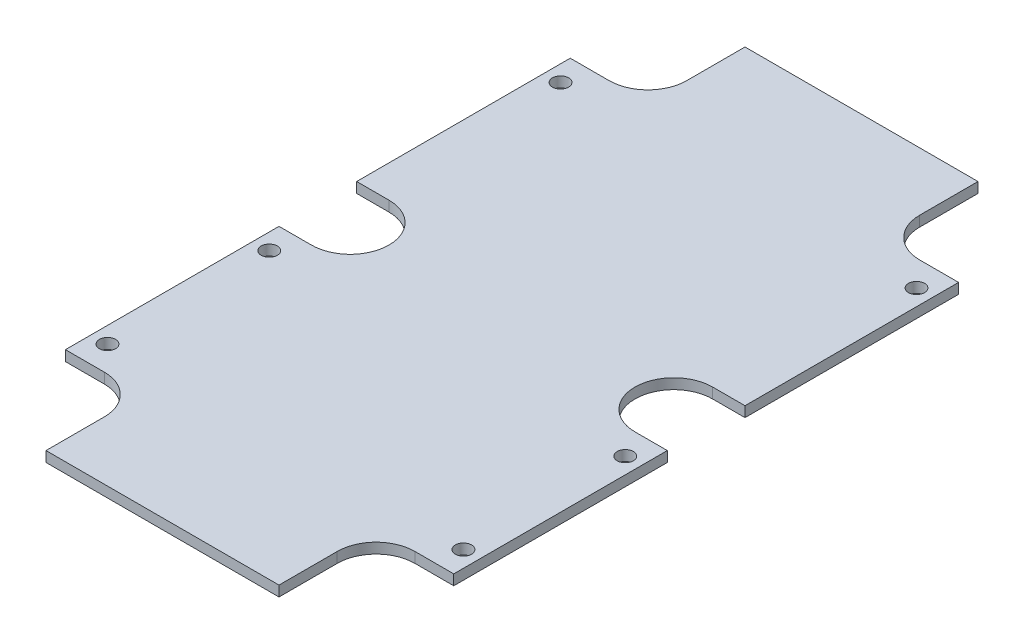
ISO-10303-21;
HEADER;
FILE_DESCRIPTION(('STEP AP214'),'2;1');
FILE_NAME('part.step','',(''),(''),'','','');
FILE_SCHEMA(('AUTOMOTIVE_DESIGN { 1 0 10303 214 1 1 1 1 }'));
ENDSEC;
DATA;
#1=APPLICATION_CONTEXT('core data for automotive mechanical design processes');
#2=APPLICATION_PROTOCOL_DEFINITION('international standard','automotive_design',2000,#1);
#3=PRODUCT_CONTEXT('',#1,'mechanical');
#4=PRODUCT('Part','Part','',(#3));
#5=PRODUCT_RELATED_PRODUCT_CATEGORY('part','',(#4));
#6=PRODUCT_DEFINITION_FORMATION('','',#4);
#7=PRODUCT_DEFINITION_CONTEXT('part definition',#1,'design');
#8=PRODUCT_DEFINITION('design','',#6,#7);
#9=PRODUCT_DEFINITION_SHAPE('','',#8);
#10=(LENGTH_UNIT() NAMED_UNIT(*) SI_UNIT(.MILLI.,.METRE.));
#11=(NAMED_UNIT(*) PLANE_ANGLE_UNIT() SI_UNIT($,.RADIAN.));
#12=(NAMED_UNIT(*) SI_UNIT($,.STERADIAN.) SOLID_ANGLE_UNIT());
#13=UNCERTAINTY_MEASURE_WITH_UNIT(LENGTH_MEASURE(1.E-05),#10,'distance_accuracy_value','');
#14=(GEOMETRIC_REPRESENTATION_CONTEXT(3) GLOBAL_UNCERTAINTY_ASSIGNED_CONTEXT((#13)) GLOBAL_UNIT_ASSIGNED_CONTEXT((#10,
#11,#12)) REPRESENTATION_CONTEXT('',''));
#15=CARTESIAN_POINT('',(0.,0.,0.));
#16=DIRECTION('',(0.,0.,1.));
#17=DIRECTION('',(1.,0.,0.));
#18=AXIS2_PLACEMENT_3D('',#15,#16,#17);
#19=CARTESIAN_POINT('',(24.,1.6,45.));
#20=DIRECTION('',(0.,-1.,0.));
#21=DIRECTION('',(0.,0.,-1.));
#22=AXIS2_PLACEMENT_3D('',#19,#20,#21);
#23=CYLINDRICAL_SURFACE('',#22,6.);
#24=CARTESIAN_POINT('',(24.,0.,45.));
#25=DIRECTION('',(0.,1.,0.));
#26=DIRECTION('',(0.,0.,1.));
#27=AXIS2_PLACEMENT_3D('',#24,#25,#26);
#28=CIRCLE('',#27,6.);
#29=CARTESIAN_POINT('',(24.0000000000001,0.,39.));
#30=VERTEX_POINT('',#29);
#31=CARTESIAN_POINT('',(18.,0.,45.));
#32=VERTEX_POINT('',#31);
#33=EDGE_CURVE('E240',#30,#32,#28,.T.);
#34=ORIENTED_EDGE('',*,*,#33,.F.);
#35=DIRECTION('',(0.,-1.,0.));
#36=VECTOR('',#35,1.);
#37=CARTESIAN_POINT('',(24.0000000000001,1.6,39.));
#38=LINE('',#37,#36);
#39=CARTESIAN_POINT('',(24.0000000000001,1.6,39.));
#40=VERTEX_POINT('',#39);
#41=EDGE_CURVE('E11',#40,#30,#38,.T.);
#42=ORIENTED_EDGE('',*,*,#41,.F.);
#43=CARTESIAN_POINT('',(24.,1.6,45.));
#44=DIRECTION('',(0.,1.,0.));
#45=DIRECTION('',(0.,0.,1.));
#46=AXIS2_PLACEMENT_3D('',#43,#44,#45);
#47=CIRCLE('',#46,6.);
#48=CARTESIAN_POINT('',(18.,1.6,45.));
#49=VERTEX_POINT('',#48);
#50=EDGE_CURVE('E327',#40,#49,#47,.T.);
#51=ORIENTED_EDGE('',*,*,#50,.T.);
#52=DIRECTION('',(0.,-1.,0.));
#53=VECTOR('',#52,1.);
#54=CARTESIAN_POINT('',(18.,1.6,45.));
#55=LINE('',#54,#53);
#56=EDGE_CURVE('E42',#49,#32,#55,.T.);
#57=ORIENTED_EDGE('',*,*,#56,.T.);
#58=EDGE_LOOP('',(#34,#42,#51,#57));
#59=FACE_BOUND('',#58,.T.);
#60=ADVANCED_FACE('F39',(#59),#23,.F.);
#61=CARTESIAN_POINT('',(24.0000000000001,1.6,39.));
#62=DIRECTION('',(0.,0.,-1.));
#63=DIRECTION('',(-1.,0.,0.));
#64=AXIS2_PLACEMENT_3D('',#61,#62,#63);
#65=PLANE('',#64);
#66=DIRECTION('',(1.,0.,0.));
#67=VECTOR('',#66,1.);
#68=CARTESIAN_POINT('',(24.0000000000001,0.,39.));
#69=LINE('',#68,#67);
#70=CARTESIAN_POINT('',(30.,0.,39.));
#71=VERTEX_POINT('',#70);
#72=EDGE_CURVE('E133',#30,#71,#69,.T.);
#73=ORIENTED_EDGE('',*,*,#72,.T.);
#74=DIRECTION('',(0.,-1.,0.));
#75=VECTOR('',#74,1.);
#76=CARTESIAN_POINT('',(30.,1.6,39.));
#77=LINE('',#76,#75);
#78=CARTESIAN_POINT('',(30.,1.6,39.));
#79=VERTEX_POINT('',#78);
#80=EDGE_CURVE('E49',#79,#71,#77,.T.);
#81=ORIENTED_EDGE('',*,*,#80,.F.);
#82=DIRECTION('',(1.,0.,0.));
#83=VECTOR('',#82,1.);
#84=CARTESIAN_POINT('',(24.0000000000001,1.6,39.));
#85=LINE('',#84,#83);
#86=EDGE_CURVE('E214',#40,#79,#85,.T.);
#87=ORIENTED_EDGE('',*,*,#86,.F.);
#88=ORIENTED_EDGE('',*,*,#41,.T.);
#89=EDGE_LOOP('',(#73,#81,#87,#88));
#90=FACE_BOUND('',#89,.T.);
#91=ADVANCED_FACE('F546',(#90),#65,.F.);
#92=CARTESIAN_POINT('',(30.,1.6,39.));
#93=DIRECTION('',(-1.,0.,0.));
#94=DIRECTION('',(0.,0.,1.));
#95=AXIS2_PLACEMENT_3D('',#92,#93,#94);
#96=PLANE('',#95);
#97=DIRECTION('',(0.,0.,-1.));
#98=VECTOR('',#97,1.);
#99=CARTESIAN_POINT('',(30.,0.,39.));
#100=LINE('',#99,#98);
#101=CARTESIAN_POINT('',(30.,0.,6.));
#102=VERTEX_POINT('',#101);
#103=EDGE_CURVE('E222',#71,#102,#100,.T.);
#104=ORIENTED_EDGE('',*,*,#103,.T.);
#105=DIRECTION('',(0.,-1.,0.));
#106=VECTOR('',#105,1.);
#107=CARTESIAN_POINT('',(30.,1.6,6.));
#108=LINE('',#107,#106);
#109=CARTESIAN_POINT('',(30.,1.6,6.));
#110=VERTEX_POINT('',#109);
#111=EDGE_CURVE('E219',#110,#102,#108,.T.);
#112=ORIENTED_EDGE('',*,*,#111,.F.);
#113=DIRECTION('',(0.,0.,-1.));
#114=VECTOR('',#113,1.);
#115=CARTESIAN_POINT('',(30.,1.6,39.));
#116=LINE('',#115,#114);
#117=EDGE_CURVE('E206',#79,#110,#116,.T.);
#118=ORIENTED_EDGE('',*,*,#117,.F.);
#119=ORIENTED_EDGE('',*,*,#80,.T.);
#120=EDGE_LOOP('',(#104,#112,#118,#119));
#121=FACE_BOUND('',#120,.T.);
#122=ADVANCED_FACE('F220',(#121),#96,.F.);
#123=CARTESIAN_POINT('',(25.,1.6,6.));
#124=DIRECTION('',(0.,0.,-1.));
#125=DIRECTION('',(-1.,0.,0.));
#126=AXIS2_PLACEMENT_3D('',#123,#124,#125);
#127=PLANE('',#126);
#128=DIRECTION('',(1.,0.,0.));
#129=VECTOR('',#128,1.);
#130=CARTESIAN_POINT('',(25.,0.,6.));
#131=LINE('',#130,#129);
#132=CARTESIAN_POINT('',(25.,0.,6.));
#133=VERTEX_POINT('',#132);
#134=EDGE_CURVE('E321',#133,#102,#131,.T.);
#135=ORIENTED_EDGE('',*,*,#134,.F.);
#136=DIRECTION('',(0.,-1.,0.));
#137=VECTOR('',#136,1.);
#138=CARTESIAN_POINT('',(25.,1.6,6.));
#139=LINE('',#138,#137);
#140=CARTESIAN_POINT('',(25.,1.6,6.));
#141=VERTEX_POINT('',#140);
#142=EDGE_CURVE('E227',#141,#133,#139,.T.);
#143=ORIENTED_EDGE('',*,*,#142,.F.);
#144=DIRECTION('',(1.,0.,0.));
#145=VECTOR('',#144,1.);
#146=CARTESIAN_POINT('',(25.,1.6,6.));
#147=LINE('',#146,#145);
#148=EDGE_CURVE('E212',#141,#110,#147,.T.);
#149=ORIENTED_EDGE('',*,*,#148,.T.);
#150=ORIENTED_EDGE('',*,*,#111,.T.);
#151=EDGE_LOOP('',(#135,#143,#149,#150));
#152=FACE_BOUND('',#151,.T.);
#153=ADVANCED_FACE('F229',(#152),#127,.T.);
#154=CARTESIAN_POINT('',(25.,1.6,0.));
#155=DIRECTION('',(0.,-1.,0.));
#156=DIRECTION('',(0.,0.,-1.));
#157=AXIS2_PLACEMENT_3D('',#154,#155,#156);
#158=CYLINDRICAL_SURFACE('',#157,6.);
#159=CARTESIAN_POINT('',(25.,0.,0.));
#160=DIRECTION('',(0.,1.,0.));
#161=DIRECTION('',(0.,0.,1.));
#162=AXIS2_PLACEMENT_3D('',#159,#160,#161);
#163=CIRCLE('',#162,6.);
#164=CARTESIAN_POINT('',(25.,0.,-6.));
#165=VERTEX_POINT('',#164);
#166=EDGE_CURVE('E317',#165,#133,#163,.T.);
#167=ORIENTED_EDGE('',*,*,#166,.F.);
#168=DIRECTION('',(0.,-1.,0.));
#169=VECTOR('',#168,1.);
#170=CARTESIAN_POINT('',(25.,1.6,-6.));
#171=LINE('',#170,#169);
#172=CARTESIAN_POINT('',(25.,1.6,-6.));
#173=VERTEX_POINT('',#172);
#174=EDGE_CURVE('E333',#173,#165,#171,.T.);
#175=ORIENTED_EDGE('',*,*,#174,.F.);
#176=CARTESIAN_POINT('',(25.,1.6,0.));
#177=DIRECTION('',(0.,1.,0.));
#178=DIRECTION('',(0.,0.,1.));
#179=AXIS2_PLACEMENT_3D('',#176,#177,#178);
#180=CIRCLE('',#179,6.);
#181=EDGE_CURVE('E231',#173,#141,#180,.T.);
#182=ORIENTED_EDGE('',*,*,#181,.T.);
#183=ORIENTED_EDGE('',*,*,#142,.T.);
#184=EDGE_LOOP('',(#167,#175,#182,#183));
#185=FACE_BOUND('',#184,.T.);
#186=ADVANCED_FACE('F402',(#185),#158,.F.);
#187=CARTESIAN_POINT('',(25.,1.6,-6.));
#188=DIRECTION('',(0.,0.,-1.));
#189=DIRECTION('',(-1.,0.,0.));
#190=AXIS2_PLACEMENT_3D('',#187,#188,#189);
#191=PLANE('',#190);
#192=DIRECTION('',(1.,0.,0.));
#193=VECTOR('',#192,1.);
#194=CARTESIAN_POINT('',(25.,0.,-6.));
#195=LINE('',#194,#193);
#196=CARTESIAN_POINT('',(30.,0.,-5.99999999999999));
#197=VERTEX_POINT('',#196);
#198=EDGE_CURVE('E314',#165,#197,#195,.T.);
#199=ORIENTED_EDGE('',*,*,#198,.T.);
#200=DIRECTION('',(0.,-1.,0.));
#201=VECTOR('',#200,1.);
#202=CARTESIAN_POINT('',(30.,1.6,-5.99999999999999));
#203=LINE('',#202,#201);
#204=CARTESIAN_POINT('',(30.,1.6,-5.99999999999999));
#205=VERTEX_POINT('',#204);
#206=EDGE_CURVE('E336',#205,#197,#203,.T.);
#207=ORIENTED_EDGE('',*,*,#206,.F.);
#208=DIRECTION('',(1.,0.,0.));
#209=VECTOR('',#208,1.);
#210=CARTESIAN_POINT('',(25.,1.6,-6.));
#211=LINE('',#210,#209);
#212=EDGE_CURVE('E234',#173,#205,#211,.T.);
#213=ORIENTED_EDGE('',*,*,#212,.F.);
#214=ORIENTED_EDGE('',*,*,#174,.T.);
#215=EDGE_LOOP('',(#199,#207,#213,#214));
#216=FACE_BOUND('',#215,.T.);
#217=ADVANCED_FACE('F410',(#216),#191,.F.);
#218=CARTESIAN_POINT('',(30.,1.6,-5.99999999999999));
#219=DIRECTION('',(-1.,0.,0.));
#220=DIRECTION('',(0.,0.,1.));
#221=AXIS2_PLACEMENT_3D('',#218,#219,#220);
#222=PLANE('',#221);
#223=DIRECTION('',(0.,0.,-1.));
#224=VECTOR('',#223,1.);
#225=CARTESIAN_POINT('',(30.,0.,-5.99999999999999));
#226=LINE('',#225,#224);
#227=CARTESIAN_POINT('',(30.,0.,-39.));
#228=VERTEX_POINT('',#227);
#229=EDGE_CURVE('E311',#197,#228,#226,.T.);
#230=ORIENTED_EDGE('',*,*,#229,.T.);
#231=DIRECTION('',(0.,-1.,0.));
#232=VECTOR('',#231,1.);
#233=CARTESIAN_POINT('',(30.,1.6,-39.));
#234=LINE('',#233,#232);
#235=CARTESIAN_POINT('',(30.,1.6,-39.));
#236=VERTEX_POINT('',#235);
#237=EDGE_CURVE('E340',#236,#228,#234,.T.);
#238=ORIENTED_EDGE('',*,*,#237,.F.);
#239=DIRECTION('',(0.,0.,-1.));
#240=VECTOR('',#239,1.);
#241=CARTESIAN_POINT('',(30.,1.6,-5.99999999999999));
#242=LINE('',#241,#240);
#243=EDGE_CURVE('E406',#205,#236,#242,.T.);
#244=ORIENTED_EDGE('',*,*,#243,.F.);
#245=ORIENTED_EDGE('',*,*,#206,.T.);
#246=EDGE_LOOP('',(#230,#238,#244,#245));
#247=FACE_BOUND('',#246,.T.);
#248=ADVANCED_FACE('F412',(#247),#222,.F.);
#249=CARTESIAN_POINT('',(30.,1.6,-39.));
#250=DIRECTION('',(0.,0.,1.));
#251=DIRECTION('',(1.,0.,0.));
#252=AXIS2_PLACEMENT_3D('',#249,#250,#251);
#253=PLANE('',#252);
#254=DIRECTION('',(-1.,0.,0.));
#255=VECTOR('',#254,1.);
#256=CARTESIAN_POINT('',(30.,0.,-39.));
#257=LINE('',#256,#255);
#258=CARTESIAN_POINT('',(24.0000000000001,0.,-39.));
#259=VERTEX_POINT('',#258);
#260=EDGE_CURVE('E308',#228,#259,#257,.T.);
#261=ORIENTED_EDGE('',*,*,#260,.T.);
#262=DIRECTION('',(0.,-1.,0.));
#263=VECTOR('',#262,1.);
#264=CARTESIAN_POINT('',(24.0000000000001,1.6,-39.));
#265=LINE('',#264,#263);
#266=CARTESIAN_POINT('',(24.0000000000001,1.6,-39.));
#267=VERTEX_POINT('',#266);
#268=EDGE_CURVE('E344',#267,#259,#265,.T.);
#269=ORIENTED_EDGE('',*,*,#268,.F.);
#270=DIRECTION('',(-1.,0.,0.));
#271=VECTOR('',#270,1.);
#272=CARTESIAN_POINT('',(30.,1.6,-39.));
#273=LINE('',#272,#271);
#274=EDGE_CURVE('E415',#236,#267,#273,.T.);
#275=ORIENTED_EDGE('',*,*,#274,.F.);
#276=ORIENTED_EDGE('',*,*,#237,.T.);
#277=EDGE_LOOP('',(#261,#269,#275,#276));
#278=FACE_BOUND('',#277,.T.);
#279=ADVANCED_FACE('F566',(#278),#253,.F.);
#280=CARTESIAN_POINT('',(24.,1.6,-45.));
#281=DIRECTION('',(0.,-1.,0.));
#282=DIRECTION('',(0.,0.,-1.));
#283=AXIS2_PLACEMENT_3D('',#280,#281,#282);
#284=CYLINDRICAL_SURFACE('',#283,6.);
#285=CARTESIAN_POINT('',(24.,0.,-45.));
#286=DIRECTION('',(0.,-1.,0.));
#287=DIRECTION('',(0.,0.,-1.));
#288=AXIS2_PLACEMENT_3D('',#285,#286,#287);
#289=CIRCLE('',#288,6.);
#290=CARTESIAN_POINT('',(18.,0.,-45.));
#291=VERTEX_POINT('',#290);
#292=EDGE_CURVE('E304',#259,#291,#289,.T.);
#293=ORIENTED_EDGE('',*,*,#292,.T.);
#294=DIRECTION('',(0.,-1.,0.));
#295=VECTOR('',#294,1.);
#296=CARTESIAN_POINT('',(18.,1.6,-45.));
#297=LINE('',#296,#295);
#298=CARTESIAN_POINT('',(18.,1.6,-45.));
#299=VERTEX_POINT('',#298);
#300=EDGE_CURVE('E348',#299,#291,#297,.T.);
#301=ORIENTED_EDGE('',*,*,#300,.F.);
#302=CARTESIAN_POINT('',(24.,1.6,-45.));
#303=DIRECTION('',(0.,-1.,0.));
#304=DIRECTION('',(0.,0.,-1.));
#305=AXIS2_PLACEMENT_3D('',#302,#303,#304);
#306=CIRCLE('',#305,6.);
#307=EDGE_CURVE('E418',#267,#299,#306,.T.);
#308=ORIENTED_EDGE('',*,*,#307,.F.);
#309=ORIENTED_EDGE('',*,*,#268,.T.);
#310=EDGE_LOOP('',(#293,#301,#308,#309));
#311=FACE_BOUND('',#310,.T.);
#312=ADVANCED_FACE('F569',(#311),#284,.F.);
#313=CARTESIAN_POINT('',(18.,1.6,-54.));
#314=DIRECTION('',(1.,0.,0.));
#315=DIRECTION('',(0.,0.,-1.));
#316=AXIS2_PLACEMENT_3D('',#313,#314,#315);
#317=PLANE('',#316);
#318=DIRECTION('',(0.,0.,1.));
#319=VECTOR('',#318,1.);
#320=CARTESIAN_POINT('',(18.,0.,-54.));
#321=LINE('',#320,#319);
#322=CARTESIAN_POINT('',(18.,0.,-54.));
#323=VERTEX_POINT('',#322);
#324=EDGE_CURVE('E300',#323,#291,#321,.T.);
#325=ORIENTED_EDGE('',*,*,#324,.F.);
#326=DIRECTION('',(0.,-1.,0.));
#327=VECTOR('',#326,1.);
#328=CARTESIAN_POINT('',(18.,1.6,-54.));
#329=LINE('',#328,#327);
#330=CARTESIAN_POINT('',(18.,1.6,-54.));
#331=VERTEX_POINT('',#330);
#332=EDGE_CURVE('E351',#331,#323,#329,.T.);
#333=ORIENTED_EDGE('',*,*,#332,.F.);
#334=DIRECTION('',(0.,0.,1.));
#335=VECTOR('',#334,1.);
#336=CARTESIAN_POINT('',(18.,1.6,-54.));
#337=LINE('',#336,#335);
#338=EDGE_CURVE('E423',#331,#299,#337,.T.);
#339=ORIENTED_EDGE('',*,*,#338,.T.);
#340=ORIENTED_EDGE('',*,*,#300,.T.);
#341=EDGE_LOOP('',(#325,#333,#339,#340));
#342=FACE_BOUND('',#341,.T.);
#343=ADVANCED_FACE('F573',(#342),#317,.T.);
#344=CARTESIAN_POINT('',(-18.,1.6,-54.));
#345=DIRECTION('',(0.,0.,-1.));
#346=DIRECTION('',(-1.,0.,0.));
#347=AXIS2_PLACEMENT_3D('',#344,#345,#346);
#348=PLANE('',#347);
#349=DIRECTION('',(1.,0.,0.));
#350=VECTOR('',#349,1.);
#351=CARTESIAN_POINT('',(-18.,0.,-54.));
#352=LINE('',#351,#350);
#353=CARTESIAN_POINT('',(-18.,0.,-54.));
#354=VERTEX_POINT('',#353);
#355=EDGE_CURVE('E296',#354,#323,#352,.T.);
#356=ORIENTED_EDGE('',*,*,#355,.F.);
#357=DIRECTION('',(0.,-1.,0.));
#358=VECTOR('',#357,1.);
#359=CARTESIAN_POINT('',(-18.,1.6,-54.));
#360=LINE('',#359,#358);
#361=CARTESIAN_POINT('',(-18.,1.6,-54.));
#362=VERTEX_POINT('',#361);
#363=EDGE_CURVE('E354',#362,#354,#360,.T.);
#364=ORIENTED_EDGE('',*,*,#363,.F.);
#365=DIRECTION('',(1.,0.,0.));
#366=VECTOR('',#365,1.);
#367=CARTESIAN_POINT('',(-18.,1.6,-54.));
#368=LINE('',#367,#366);
#369=EDGE_CURVE('E427',#362,#331,#368,.T.);
#370=ORIENTED_EDGE('',*,*,#369,.T.);
#371=ORIENTED_EDGE('',*,*,#332,.T.);
#372=EDGE_LOOP('',(#356,#364,#370,#371));
#373=FACE_BOUND('',#372,.T.);
#374=ADVANCED_FACE('F577',(#373),#348,.T.);
#375=CARTESIAN_POINT('',(-18.,1.6,-54.));
#376=DIRECTION('',(1.,0.,0.));
#377=DIRECTION('',(0.,0.,-1.));
#378=AXIS2_PLACEMENT_3D('',#375,#376,#377);
#379=PLANE('',#378);
#380=DIRECTION('',(0.,0.,1.));
#381=VECTOR('',#380,1.);
#382=CARTESIAN_POINT('',(-18.,0.,-54.));
#383=LINE('',#382,#381);
#384=CARTESIAN_POINT('',(-18.,0.,-45.));
#385=VERTEX_POINT('',#384);
#386=EDGE_CURVE('E292',#354,#385,#383,.T.);
#387=ORIENTED_EDGE('',*,*,#386,.T.);
#388=DIRECTION('',(0.,-1.,0.));
#389=VECTOR('',#388,1.);
#390=CARTESIAN_POINT('',(-18.,1.6,-45.));
#391=LINE('',#390,#389);
#392=CARTESIAN_POINT('',(-18.,1.6,-45.));
#393=VERTEX_POINT('',#392);
#394=EDGE_CURVE('E357',#393,#385,#391,.T.);
#395=ORIENTED_EDGE('',*,*,#394,.F.);
#396=DIRECTION('',(0.,0.,1.));
#397=VECTOR('',#396,1.);
#398=CARTESIAN_POINT('',(-18.,1.6,-54.));
#399=LINE('',#398,#397);
#400=EDGE_CURVE('E431',#362,#393,#399,.T.);
#401=ORIENTED_EDGE('',*,*,#400,.F.);
#402=ORIENTED_EDGE('',*,*,#363,.T.);
#403=EDGE_LOOP('',(#387,#395,#401,#402));
#404=FACE_BOUND('',#403,.T.);
#405=ADVANCED_FACE('F581',(#404),#379,.F.);
#406=CARTESIAN_POINT('',(-24.,1.6,-45.));
#407=DIRECTION('',(0.,-1.,0.));
#408=DIRECTION('',(0.,0.,-1.));
#409=AXIS2_PLACEMENT_3D('',#406,#407,#408);
#410=CYLINDRICAL_SURFACE('',#409,6.);
#411=CARTESIAN_POINT('',(-24.,0.,-45.));
#412=DIRECTION('',(0.,1.,0.));
#413=DIRECTION('',(0.,0.,1.));
#414=AXIS2_PLACEMENT_3D('',#411,#412,#413);
#415=CIRCLE('',#414,6.);
#416=CARTESIAN_POINT('',(-24.,0.,-39.));
#417=VERTEX_POINT('',#416);
#418=EDGE_CURVE('E288',#417,#385,#415,.T.);
#419=ORIENTED_EDGE('',*,*,#418,.F.);
#420=DIRECTION('',(0.,-1.,0.));
#421=VECTOR('',#420,1.);
#422=CARTESIAN_POINT('',(-24.,1.6,-39.));
#423=LINE('',#422,#421);
#424=CARTESIAN_POINT('',(-24.,1.6,-39.));
#425=VERTEX_POINT('',#424);
#426=EDGE_CURVE('E360',#425,#417,#423,.T.);
#427=ORIENTED_EDGE('',*,*,#426,.F.);
#428=CARTESIAN_POINT('',(-24.,1.6,-45.));
#429=DIRECTION('',(0.,1.,0.));
#430=DIRECTION('',(0.,0.,1.));
#431=AXIS2_PLACEMENT_3D('',#428,#429,#430);
#432=CIRCLE('',#431,6.);
#433=EDGE_CURVE('E434',#425,#393,#432,.T.);
#434=ORIENTED_EDGE('',*,*,#433,.T.);
#435=ORIENTED_EDGE('',*,*,#394,.T.);
#436=EDGE_LOOP('',(#419,#427,#434,#435));
#437=FACE_BOUND('',#436,.T.);
#438=ADVANCED_FACE('F585',(#437),#410,.F.);
#439=CARTESIAN_POINT('',(-30.,1.6,-39.));
#440=DIRECTION('',(0.,0.,-1.));
#441=DIRECTION('',(-1.,0.,0.));
#442=AXIS2_PLACEMENT_3D('',#439,#440,#441);
#443=PLANE('',#442);
#444=DIRECTION('',(1.,0.,0.));
#445=VECTOR('',#444,1.);
#446=CARTESIAN_POINT('',(-30.,0.,-39.));
#447=LINE('',#446,#445);
#448=CARTESIAN_POINT('',(-30.,0.,-39.));
#449=VERTEX_POINT('',#448);
#450=EDGE_CURVE('E284',#449,#417,#447,.T.);
#451=ORIENTED_EDGE('',*,*,#450,.F.);
#452=DIRECTION('',(0.,-1.,0.));
#453=VECTOR('',#452,1.);
#454=CARTESIAN_POINT('',(-30.,1.6,-39.));
#455=LINE('',#454,#453);
#456=CARTESIAN_POINT('',(-30.,1.6,-39.));
#457=VERTEX_POINT('',#456);
#458=EDGE_CURVE('E363',#457,#449,#455,.T.);
#459=ORIENTED_EDGE('',*,*,#458,.F.);
#460=DIRECTION('',(1.,0.,0.));
#461=VECTOR('',#460,1.);
#462=CARTESIAN_POINT('',(-30.,1.6,-39.));
#463=LINE('',#462,#461);
#464=EDGE_CURVE('E438',#457,#425,#463,.T.);
#465=ORIENTED_EDGE('',*,*,#464,.T.);
#466=ORIENTED_EDGE('',*,*,#426,.T.);
#467=EDGE_LOOP('',(#451,#459,#465,#466));
#468=FACE_BOUND('',#467,.T.);
#469=ADVANCED_FACE('F589',(#468),#443,.T.);
#470=CARTESIAN_POINT('',(-30.,1.6,-5.99999999999999));
#471=DIRECTION('',(-1.,0.,0.));
#472=DIRECTION('',(0.,0.,1.));
#473=AXIS2_PLACEMENT_3D('',#470,#471,#472);
#474=PLANE('',#473);
#475=DIRECTION('',(0.,0.,-1.));
#476=VECTOR('',#475,1.);
#477=CARTESIAN_POINT('',(-30.,0.,-5.99999999999999));
#478=LINE('',#477,#476);
#479=CARTESIAN_POINT('',(-30.,0.,-5.99999999999999));
#480=VERTEX_POINT('',#479);
#481=EDGE_CURVE('E280',#480,#449,#478,.T.);
#482=ORIENTED_EDGE('',*,*,#481,.F.);
#483=DIRECTION('',(0.,-1.,0.));
#484=VECTOR('',#483,1.);
#485=CARTESIAN_POINT('',(-30.,1.6,-5.99999999999999));
#486=LINE('',#485,#484);
#487=CARTESIAN_POINT('',(-30.,1.6,-5.99999999999999));
#488=VERTEX_POINT('',#487);
#489=EDGE_CURVE('E366',#488,#480,#486,.T.);
#490=ORIENTED_EDGE('',*,*,#489,.F.);
#491=DIRECTION('',(0.,0.,-1.));
#492=VECTOR('',#491,1.);
#493=CARTESIAN_POINT('',(-30.,1.6,-5.99999999999999));
#494=LINE('',#493,#492);
#495=EDGE_CURVE('E442',#488,#457,#494,.T.);
#496=ORIENTED_EDGE('',*,*,#495,.T.);
#497=ORIENTED_EDGE('',*,*,#458,.T.);
#498=EDGE_LOOP('',(#482,#490,#496,#497));
#499=FACE_BOUND('',#498,.T.);
#500=ADVANCED_FACE('F593',(#499),#474,.T.);
#501=CARTESIAN_POINT('',(-30.,1.6,-5.99999999999999));
#502=DIRECTION('',(0.,0.,-1.));
#503=DIRECTION('',(-1.,0.,0.));
#504=AXIS2_PLACEMENT_3D('',#501,#502,#503);
#505=PLANE('',#504);
#506=DIRECTION('',(1.,0.,0.));
#507=VECTOR('',#506,1.);
#508=CARTESIAN_POINT('',(-30.,0.,-5.99999999999999));
#509=LINE('',#508,#507);
#510=CARTESIAN_POINT('',(-25.,0.,-6.));
#511=VERTEX_POINT('',#510);
#512=EDGE_CURVE('E276',#480,#511,#509,.T.);
#513=ORIENTED_EDGE('',*,*,#512,.T.);
#514=DIRECTION('',(0.,-1.,0.));
#515=VECTOR('',#514,1.);
#516=CARTESIAN_POINT('',(-25.,1.6,-6.));
#517=LINE('',#516,#515);
#518=CARTESIAN_POINT('',(-25.,1.6,-6.));
#519=VERTEX_POINT('',#518);
#520=EDGE_CURVE('E369',#519,#511,#517,.T.);
#521=ORIENTED_EDGE('',*,*,#520,.F.);
#522=DIRECTION('',(1.,0.,0.));
#523=VECTOR('',#522,1.);
#524=CARTESIAN_POINT('',(-30.,1.6,-5.99999999999999));
#525=LINE('',#524,#523);
#526=EDGE_CURVE('E446',#488,#519,#525,.T.);
#527=ORIENTED_EDGE('',*,*,#526,.F.);
#528=ORIENTED_EDGE('',*,*,#489,.T.);
#529=EDGE_LOOP('',(#513,#521,#527,#528));
#530=FACE_BOUND('',#529,.T.);
#531=ADVANCED_FACE('F597',(#530),#505,.F.);
#532=CARTESIAN_POINT('',(-25.,1.6,0.));
#533=DIRECTION('',(0.,-1.,0.));
#534=DIRECTION('',(0.,0.,-1.));
#535=AXIS2_PLACEMENT_3D('',#532,#533,#534);
#536=CYLINDRICAL_SURFACE('',#535,6.);
#537=CARTESIAN_POINT('',(-25.,0.,0.));
#538=DIRECTION('',(0.,1.,0.));
#539=DIRECTION('',(0.,0.,1.));
#540=AXIS2_PLACEMENT_3D('',#537,#538,#539);
#541=CIRCLE('',#540,6.);
#542=CARTESIAN_POINT('',(-25.,0.,6.));
#543=VERTEX_POINT('',#542);
#544=EDGE_CURVE('E272',#543,#511,#541,.T.);
#545=ORIENTED_EDGE('',*,*,#544,.F.);
#546=DIRECTION('',(0.,-1.,0.));
#547=VECTOR('',#546,1.);
#548=CARTESIAN_POINT('',(-25.,1.6,6.));
#549=LINE('',#548,#547);
#550=CARTESIAN_POINT('',(-25.,1.6,6.));
#551=VERTEX_POINT('',#550);
#552=EDGE_CURVE('E372',#551,#543,#549,.T.);
#553=ORIENTED_EDGE('',*,*,#552,.F.);
#554=CARTESIAN_POINT('',(-25.,1.6,0.));
#555=DIRECTION('',(0.,1.,0.));
#556=DIRECTION('',(0.,0.,1.));
#557=AXIS2_PLACEMENT_3D('',#554,#555,#556);
#558=CIRCLE('',#557,6.);
#559=EDGE_CURVE('E449',#551,#519,#558,.T.);
#560=ORIENTED_EDGE('',*,*,#559,.T.);
#561=ORIENTED_EDGE('',*,*,#520,.T.);
#562=EDGE_LOOP('',(#545,#553,#560,#561));
#563=FACE_BOUND('',#562,.T.);
#564=ADVANCED_FACE('F601',(#563),#536,.F.);
#565=CARTESIAN_POINT('',(-30.,1.6,6.));
#566=DIRECTION('',(0.,0.,-1.));
#567=DIRECTION('',(-1.,0.,0.));
#568=AXIS2_PLACEMENT_3D('',#565,#566,#567);
#569=PLANE('',#568);
#570=DIRECTION('',(1.,0.,0.));
#571=VECTOR('',#570,1.);
#572=CARTESIAN_POINT('',(-30.,0.,6.));
#573=LINE('',#572,#571);
#574=CARTESIAN_POINT('',(-30.,0.,6.));
#575=VERTEX_POINT('',#574);
#576=EDGE_CURVE('E268',#575,#543,#573,.T.);
#577=ORIENTED_EDGE('',*,*,#576,.F.);
#578=DIRECTION('',(0.,-1.,0.));
#579=VECTOR('',#578,1.);
#580=CARTESIAN_POINT('',(-30.,1.6,6.));
#581=LINE('',#580,#579);
#582=CARTESIAN_POINT('',(-30.,1.6,6.));
#583=VERTEX_POINT('',#582);
#584=EDGE_CURVE('E375',#583,#575,#581,.T.);
#585=ORIENTED_EDGE('',*,*,#584,.F.);
#586=DIRECTION('',(1.,0.,0.));
#587=VECTOR('',#586,1.);
#588=CARTESIAN_POINT('',(-30.,1.6,6.));
#589=LINE('',#588,#587);
#590=EDGE_CURVE('E453',#583,#551,#589,.T.);
#591=ORIENTED_EDGE('',*,*,#590,.T.);
#592=ORIENTED_EDGE('',*,*,#552,.T.);
#593=EDGE_LOOP('',(#577,#585,#591,#592));
#594=FACE_BOUND('',#593,.T.);
#595=ADVANCED_FACE('F605',(#594),#569,.T.);
#596=CARTESIAN_POINT('',(-30.,1.6,39.));
#597=DIRECTION('',(-1.,0.,0.));
#598=DIRECTION('',(0.,0.,1.));
#599=AXIS2_PLACEMENT_3D('',#596,#597,#598);
#600=PLANE('',#599);
#601=DIRECTION('',(0.,0.,-1.));
#602=VECTOR('',#601,1.);
#603=CARTESIAN_POINT('',(-30.,0.,39.));
#604=LINE('',#603,#602);
#605=CARTESIAN_POINT('',(-30.,0.,39.));
#606=VERTEX_POINT('',#605);
#607=EDGE_CURVE('E264',#606,#575,#604,.T.);
#608=ORIENTED_EDGE('',*,*,#607,.F.);
#609=DIRECTION('',(0.,-1.,0.));
#610=VECTOR('',#609,1.);
#611=CARTESIAN_POINT('',(-30.,1.6,39.));
#612=LINE('',#611,#610);
#613=CARTESIAN_POINT('',(-30.,1.6,39.));
#614=VERTEX_POINT('',#613);
#615=EDGE_CURVE('E378',#614,#606,#612,.T.);
#616=ORIENTED_EDGE('',*,*,#615,.F.);
#617=DIRECTION('',(0.,0.,-1.));
#618=VECTOR('',#617,1.);
#619=CARTESIAN_POINT('',(-30.,1.6,39.));
#620=LINE('',#619,#618);
#621=EDGE_CURVE('E457',#614,#583,#620,.T.);
#622=ORIENTED_EDGE('',*,*,#621,.T.);
#623=ORIENTED_EDGE('',*,*,#584,.T.);
#624=EDGE_LOOP('',(#608,#616,#622,#623));
#625=FACE_BOUND('',#624,.T.);
#626=ADVANCED_FACE('F609',(#625),#600,.T.);
#627=CARTESIAN_POINT('',(-30.,1.6,39.));
#628=DIRECTION('',(0.,0.,-1.));
#629=DIRECTION('',(-1.,0.,0.));
#630=AXIS2_PLACEMENT_3D('',#627,#628,#629);
#631=PLANE('',#630);
#632=DIRECTION('',(1.,0.,0.));
#633=VECTOR('',#632,1.);
#634=CARTESIAN_POINT('',(-30.,0.,39.));
#635=LINE('',#634,#633);
#636=CARTESIAN_POINT('',(-24.,0.,39.));
#637=VERTEX_POINT('',#636);
#638=EDGE_CURVE('E260',#606,#637,#635,.T.);
#639=ORIENTED_EDGE('',*,*,#638,.T.);
#640=DIRECTION('',(0.,-1.,0.));
#641=VECTOR('',#640,1.);
#642=CARTESIAN_POINT('',(-24.,1.6,39.));
#643=LINE('',#642,#641);
#644=CARTESIAN_POINT('',(-24.,1.6,39.));
#645=VERTEX_POINT('',#644);
#646=EDGE_CURVE('E381',#645,#637,#643,.T.);
#647=ORIENTED_EDGE('',*,*,#646,.F.);
#648=DIRECTION('',(1.,0.,0.));
#649=VECTOR('',#648,1.);
#650=CARTESIAN_POINT('',(-30.,1.6,39.));
#651=LINE('',#650,#649);
#652=EDGE_CURVE('E461',#614,#645,#651,.T.);
#653=ORIENTED_EDGE('',*,*,#652,.F.);
#654=ORIENTED_EDGE('',*,*,#615,.T.);
#655=EDGE_LOOP('',(#639,#647,#653,#654));
#656=FACE_BOUND('',#655,.T.);
#657=ADVANCED_FACE('F613',(#656),#631,.F.);
#658=CARTESIAN_POINT('',(-24.,1.6,45.));
#659=DIRECTION('',(0.,-1.,0.));
#660=DIRECTION('',(0.,0.,-1.));
#661=AXIS2_PLACEMENT_3D('',#658,#659,#660);
#662=CYLINDRICAL_SURFACE('',#661,6.);
#663=CARTESIAN_POINT('',(-24.,0.,45.));
#664=DIRECTION('',(0.,1.,0.));
#665=DIRECTION('',(0.,0.,1.));
#666=AXIS2_PLACEMENT_3D('',#663,#664,#665);
#667=CIRCLE('',#666,6.);
#668=CARTESIAN_POINT('',(-18.,0.,45.));
#669=VERTEX_POINT('',#668);
#670=EDGE_CURVE('E256',#669,#637,#667,.T.);
#671=ORIENTED_EDGE('',*,*,#670,.F.);
#672=DIRECTION('',(0.,-1.,0.));
#673=VECTOR('',#672,1.);
#674=CARTESIAN_POINT('',(-18.,1.6,45.));
#675=LINE('',#674,#673);
#676=CARTESIAN_POINT('',(-18.,1.6,45.));
#677=VERTEX_POINT('',#676);
#678=EDGE_CURVE('E384',#677,#669,#675,.T.);
#679=ORIENTED_EDGE('',*,*,#678,.F.);
#680=CARTESIAN_POINT('',(-24.,1.6,45.));
#681=DIRECTION('',(0.,1.,0.));
#682=DIRECTION('',(0.,0.,1.));
#683=AXIS2_PLACEMENT_3D('',#680,#681,#682);
#684=CIRCLE('',#683,6.);
#685=EDGE_CURVE('E464',#677,#645,#684,.T.);
#686=ORIENTED_EDGE('',*,*,#685,.T.);
#687=ORIENTED_EDGE('',*,*,#646,.T.);
#688=EDGE_LOOP('',(#671,#679,#686,#687));
#689=FACE_BOUND('',#688,.T.);
#690=ADVANCED_FACE('F617',(#689),#662,.F.);
#691=CARTESIAN_POINT('',(-18.,1.6,45.));
#692=DIRECTION('',(1.,0.,0.));
#693=DIRECTION('',(0.,0.,-1.));
#694=AXIS2_PLACEMENT_3D('',#691,#692,#693);
#695=PLANE('',#694);
#696=DIRECTION('',(0.,0.,1.));
#697=VECTOR('',#696,1.);
#698=CARTESIAN_POINT('',(-18.,0.,45.));
#699=LINE('',#698,#697);
#700=CARTESIAN_POINT('',(-18.,0.,54.));
#701=VERTEX_POINT('',#700);
#702=EDGE_CURVE('E253',#669,#701,#699,.T.);
#703=ORIENTED_EDGE('',*,*,#702,.T.);
#704=DIRECTION('',(0.,-1.,0.));
#705=VECTOR('',#704,1.);
#706=CARTESIAN_POINT('',(-18.,1.6,54.));
#707=LINE('',#706,#705);
#708=CARTESIAN_POINT('',(-18.,1.6,54.));
#709=VERTEX_POINT('',#708);
#710=EDGE_CURVE('E387',#709,#701,#707,.T.);
#711=ORIENTED_EDGE('',*,*,#710,.F.);
#712=DIRECTION('',(0.,0.,1.));
#713=VECTOR('',#712,1.);
#714=CARTESIAN_POINT('',(-18.,1.6,45.));
#715=LINE('',#714,#713);
#716=EDGE_CURVE('E468',#677,#709,#715,.T.);
#717=ORIENTED_EDGE('',*,*,#716,.F.);
#718=ORIENTED_EDGE('',*,*,#678,.T.);
#719=EDGE_LOOP('',(#703,#711,#717,#718));
#720=FACE_BOUND('',#719,.T.);
#721=ADVANCED_FACE('F621',(#720),#695,.F.);
#722=CARTESIAN_POINT('',(-18.,1.6,54.));
#723=DIRECTION('',(0.,0.,-1.));
#724=DIRECTION('',(-1.,0.,0.));
#725=AXIS2_PLACEMENT_3D('',#722,#723,#724);
#726=PLANE('',#725);
#727=DIRECTION('',(1.,0.,0.));
#728=VECTOR('',#727,1.);
#729=CARTESIAN_POINT('',(-18.,0.,54.));
#730=LINE('',#729,#728);
#731=CARTESIAN_POINT('',(18.,0.,54.));
#732=VERTEX_POINT('',#731);
#733=EDGE_CURVE('E249',#701,#732,#730,.T.);
#734=ORIENTED_EDGE('',*,*,#733,.T.);
#735=DIRECTION('',(0.,-1.,0.));
#736=VECTOR('',#735,1.);
#737=CARTESIAN_POINT('',(18.,1.6,54.));
#738=LINE('',#737,#736);
#739=CARTESIAN_POINT('',(18.,1.6,54.));
#740=VERTEX_POINT('',#739);
#741=EDGE_CURVE('E390',#740,#732,#738,.T.);
#742=ORIENTED_EDGE('',*,*,#741,.F.);
#743=DIRECTION('',(1.,0.,0.));
#744=VECTOR('',#743,1.);
#745=CARTESIAN_POINT('',(-18.,1.6,54.));
#746=LINE('',#745,#744);
#747=EDGE_CURVE('E471',#709,#740,#746,.T.);
#748=ORIENTED_EDGE('',*,*,#747,.F.);
#749=ORIENTED_EDGE('',*,*,#710,.T.);
#750=EDGE_LOOP('',(#734,#742,#748,#749));
#751=FACE_BOUND('',#750,.T.);
#752=ADVANCED_FACE('F625',(#751),#726,.F.);
#753=CARTESIAN_POINT('',(18.,1.6,45.));
#754=DIRECTION('',(1.,0.,0.));
#755=DIRECTION('',(0.,0.,-1.));
#756=AXIS2_PLACEMENT_3D('',#753,#754,#755);
#757=PLANE('',#756);
#758=DIRECTION('',(0.,0.,1.));
#759=VECTOR('',#758,1.);
#760=CARTESIAN_POINT('',(18.,0.,45.));
#761=LINE('',#760,#759);
#762=EDGE_CURVE('E244',#32,#732,#761,.T.);
#763=ORIENTED_EDGE('',*,*,#762,.F.);
#764=ORIENTED_EDGE('',*,*,#56,.F.);
#765=DIRECTION('',(0.,0.,1.));
#766=VECTOR('',#765,1.);
#767=CARTESIAN_POINT('',(18.,1.6,45.));
#768=LINE('',#767,#766);
#769=EDGE_CURVE('E474',#49,#740,#768,.T.);
#770=ORIENTED_EDGE('',*,*,#769,.T.);
#771=ORIENTED_EDGE('',*,*,#741,.T.);
#772=EDGE_LOOP('',(#763,#764,#770,#771));
#773=FACE_BOUND('',#772,.T.);
#774=ADVANCED_FACE('F394',(#773),#757,.T.);
#775=CARTESIAN_POINT('',(24.,1.6,45.));
#776=DIRECTION('',(0.,1.,0.));
#777=DIRECTION('',(0.,0.,1.));
#778=AXIS2_PLACEMENT_3D('',#775,#776,#777);
#779=PLANE('',#778);
#780=CARTESIAN_POINT('',(-27.5,1.6,10.));
#781=DIRECTION('',(0.,1.,0.));
#782=DIRECTION('',(0.,0.,1.));
#783=AXIS2_PLACEMENT_3D('',#780,#781,#782);
#784=CIRCLE('',#783,1.25);
#785=CARTESIAN_POINT('',(-27.5,1.6,11.25));
#786=VERTEX_POINT('',#785);
#787=EDGE_CURVE('E503',#786,#786,#784,.T.);
#788=ORIENTED_EDGE('',*,*,#787,.F.);
#789=EDGE_LOOP('',(#788));
#790=FACE_BOUND('',#789,.T.);
#791=CARTESIAN_POINT('',(27.5,1.6,10.));
#792=DIRECTION('',(0.,1.,0.));
#793=DIRECTION('',(0.,0.,1.));
#794=AXIS2_PLACEMENT_3D('',#791,#792,#793);
#795=CIRCLE('',#794,1.25);
#796=CARTESIAN_POINT('',(27.5,1.6,11.25));
#797=VERTEX_POINT('',#796);
#798=EDGE_CURVE('E512',#797,#797,#795,.T.);
#799=ORIENTED_EDGE('',*,*,#798,.F.);
#800=EDGE_LOOP('',(#799));
#801=FACE_BOUND('',#800,.T.);
#802=CARTESIAN_POINT('',(27.5,1.6,35.));
#803=DIRECTION('',(0.,1.,0.));
#804=DIRECTION('',(0.,0.,1.));
#805=AXIS2_PLACEMENT_3D('',#802,#803,#804);
#806=CIRCLE('',#805,1.25);
#807=CARTESIAN_POINT('',(27.5,1.6,36.25));
#808=VERTEX_POINT('',#807);
#809=EDGE_CURVE('E487',#808,#808,#806,.T.);
#810=ORIENTED_EDGE('',*,*,#809,.F.);
#811=EDGE_LOOP('',(#810));
#812=FACE_BOUND('',#811,.T.);
#813=CARTESIAN_POINT('',(-27.5,1.6,-35.));
#814=DIRECTION('',(0.,1.,0.));
#815=DIRECTION('',(0.,0.,1.));
#816=AXIS2_PLACEMENT_3D('',#813,#814,#815);
#817=CIRCLE('',#816,1.25);
#818=CARTESIAN_POINT('',(-27.5,1.6,-33.75));
#819=VERTEX_POINT('',#818);
#820=EDGE_CURVE('E496',#819,#819,#817,.T.);
#821=ORIENTED_EDGE('',*,*,#820,.F.);
#822=EDGE_LOOP('',(#821));
#823=FACE_BOUND('',#822,.T.);
#824=CARTESIAN_POINT('',(-27.5,1.6,35.));
#825=DIRECTION('',(0.,1.,0.));
#826=DIRECTION('',(0.,0.,1.));
#827=AXIS2_PLACEMENT_3D('',#824,#825,#826);
#828=CIRCLE('',#827,1.25);
#829=CARTESIAN_POINT('',(-27.5,1.6,36.25));
#830=VERTEX_POINT('',#829);
#831=EDGE_CURVE('E519',#830,#830,#828,.T.);
#832=ORIENTED_EDGE('',*,*,#831,.F.);
#833=EDGE_LOOP('',(#832));
#834=FACE_BOUND('',#833,.T.);
#835=CARTESIAN_POINT('',(27.5,1.6,-35.));
#836=DIRECTION('',(0.,1.,0.));
#837=DIRECTION('',(0.,0.,1.));
#838=AXIS2_PLACEMENT_3D('',#835,#836,#837);
#839=CIRCLE('',#838,1.25);
#840=CARTESIAN_POINT('',(27.5,1.6,-33.75));
#841=VERTEX_POINT('',#840);
#842=EDGE_CURVE('E245',#841,#841,#839,.T.);
#843=ORIENTED_EDGE('',*,*,#842,.F.);
#844=EDGE_LOOP('',(#843));
#845=FACE_BOUND('',#844,.T.);
#846=ORIENTED_EDGE('',*,*,#50,.F.);
#847=ORIENTED_EDGE('',*,*,#86,.T.);
#848=ORIENTED_EDGE('',*,*,#117,.T.);
#849=ORIENTED_EDGE('',*,*,#148,.F.);
#850=ORIENTED_EDGE('',*,*,#181,.F.);
#851=ORIENTED_EDGE('',*,*,#212,.T.);
#852=ORIENTED_EDGE('',*,*,#243,.T.);
#853=ORIENTED_EDGE('',*,*,#274,.T.);
#854=ORIENTED_EDGE('',*,*,#307,.T.);
#855=ORIENTED_EDGE('',*,*,#338,.F.);
#856=ORIENTED_EDGE('',*,*,#369,.F.);
#857=ORIENTED_EDGE('',*,*,#400,.T.);
#858=ORIENTED_EDGE('',*,*,#433,.F.);
#859=ORIENTED_EDGE('',*,*,#464,.F.);
#860=ORIENTED_EDGE('',*,*,#495,.F.);
#861=ORIENTED_EDGE('',*,*,#526,.T.);
#862=ORIENTED_EDGE('',*,*,#559,.F.);
#863=ORIENTED_EDGE('',*,*,#590,.F.);
#864=ORIENTED_EDGE('',*,*,#621,.F.);
#865=ORIENTED_EDGE('',*,*,#652,.T.);
#866=ORIENTED_EDGE('',*,*,#685,.F.);
#867=ORIENTED_EDGE('',*,*,#716,.T.);
#868=ORIENTED_EDGE('',*,*,#747,.T.);
#869=ORIENTED_EDGE('',*,*,#769,.F.);
#870=EDGE_LOOP('',(#846,#847,#848,#849,#850,#851,#852,#853,#854,#855,#856,#857,#858,#859,#860,
#861,#862,#863,#864,#865,#866,#867,#868,#869));
#871=FACE_BOUND('',#870,.T.);
#872=ADVANCED_FACE('F209',(#790,#801,#812,#823,#834,#845,#871),#779,.T.);
#873=CARTESIAN_POINT('',(24.,0.,45.));
#874=DIRECTION('',(0.,1.,0.));
#875=DIRECTION('',(0.,0.,1.));
#876=AXIS2_PLACEMENT_3D('',#873,#874,#875);
#877=PLANE('',#876);
#878=CARTESIAN_POINT('',(-27.5,0.,10.));
#879=DIRECTION('',(0.,1.,0.));
#880=DIRECTION('',(0.,0.,1.));
#881=AXIS2_PLACEMENT_3D('',#878,#879,#880);
#882=CIRCLE('',#881,1.25);
#883=CARTESIAN_POINT('',(-27.5,0.,11.25));
#884=VERTEX_POINT('',#883);
#885=EDGE_CURVE('E507',#884,#884,#882,.T.);
#886=ORIENTED_EDGE('',*,*,#885,.T.);
#887=EDGE_LOOP('',(#886));
#888=FACE_BOUND('',#887,.T.);
#889=CARTESIAN_POINT('',(27.5,0.,10.));
#890=DIRECTION('',(0.,1.,0.));
#891=DIRECTION('',(0.,0.,1.));
#892=AXIS2_PLACEMENT_3D('',#889,#890,#891);
#893=CIRCLE('',#892,1.25);
#894=CARTESIAN_POINT('',(27.5,0.,11.25));
#895=VERTEX_POINT('',#894);
#896=EDGE_CURVE('E492',#895,#895,#893,.T.);
#897=ORIENTED_EDGE('',*,*,#896,.T.);
#898=EDGE_LOOP('',(#897));
#899=FACE_BOUND('',#898,.T.);
#900=CARTESIAN_POINT('',(27.5,0.,35.));
#901=DIRECTION('',(0.,1.,0.));
#902=DIRECTION('',(0.,0.,1.));
#903=AXIS2_PLACEMENT_3D('',#900,#901,#902);
#904=CIRCLE('',#903,1.25);
#905=CARTESIAN_POINT('',(27.5,0.,36.25));
#906=VERTEX_POINT('',#905);
#907=EDGE_CURVE('E491',#906,#906,#904,.T.);
#908=ORIENTED_EDGE('',*,*,#907,.T.);
#909=EDGE_LOOP('',(#908));
#910=FACE_BOUND('',#909,.T.);
#911=CARTESIAN_POINT('',(-27.5,0.,-35.));
#912=DIRECTION('',(0.,1.,0.));
#913=DIRECTION('',(0.,0.,1.));
#914=AXIS2_PLACEMENT_3D('',#911,#912,#913);
#915=CIRCLE('',#914,1.25);
#916=CARTESIAN_POINT('',(-27.5,0.,-33.75));
#917=VERTEX_POINT('',#916);
#918=EDGE_CURVE('E483',#917,#917,#915,.T.);
#919=ORIENTED_EDGE('',*,*,#918,.T.);
#920=EDGE_LOOP('',(#919));
#921=FACE_BOUND('',#920,.T.);
#922=CARTESIAN_POINT('',(-27.5,0.,35.));
#923=DIRECTION('',(0.,1.,0.));
#924=DIRECTION('',(0.,0.,1.));
#925=AXIS2_PLACEMENT_3D('',#922,#923,#924);
#926=CIRCLE('',#925,1.25);
#927=CARTESIAN_POINT('',(-27.5,0.,36.25));
#928=VERTEX_POINT('',#927);
#929=EDGE_CURVE('E508',#928,#928,#926,.T.);
#930=ORIENTED_EDGE('',*,*,#929,.T.);
#931=EDGE_LOOP('',(#930));
#932=FACE_BOUND('',#931,.T.);
#933=CARTESIAN_POINT('',(27.5,0.,-35.));
#934=DIRECTION('',(0.,1.,0.));
#935=DIRECTION('',(0.,0.,1.));
#936=AXIS2_PLACEMENT_3D('',#933,#934,#935);
#937=CIRCLE('',#936,1.25);
#938=CARTESIAN_POINT('',(27.5,0.,-33.75));
#939=VERTEX_POINT('',#938);
#940=EDGE_CURVE('E479',#939,#939,#937,.T.);
#941=ORIENTED_EDGE('',*,*,#940,.T.);
#942=EDGE_LOOP('',(#941));
#943=FACE_BOUND('',#942,.T.);
#944=ORIENTED_EDGE('',*,*,#33,.T.);
#945=ORIENTED_EDGE('',*,*,#762,.T.);
#946=ORIENTED_EDGE('',*,*,#733,.F.);
#947=ORIENTED_EDGE('',*,*,#702,.F.);
#948=ORIENTED_EDGE('',*,*,#670,.T.);
#949=ORIENTED_EDGE('',*,*,#638,.F.);
#950=ORIENTED_EDGE('',*,*,#607,.T.);
#951=ORIENTED_EDGE('',*,*,#576,.T.);
#952=ORIENTED_EDGE('',*,*,#544,.T.);
#953=ORIENTED_EDGE('',*,*,#512,.F.);
#954=ORIENTED_EDGE('',*,*,#481,.T.);
#955=ORIENTED_EDGE('',*,*,#450,.T.);
#956=ORIENTED_EDGE('',*,*,#418,.T.);
#957=ORIENTED_EDGE('',*,*,#386,.F.);
#958=ORIENTED_EDGE('',*,*,#355,.T.);
#959=ORIENTED_EDGE('',*,*,#324,.T.);
#960=ORIENTED_EDGE('',*,*,#292,.F.);
#961=ORIENTED_EDGE('',*,*,#260,.F.);
#962=ORIENTED_EDGE('',*,*,#229,.F.);
#963=ORIENTED_EDGE('',*,*,#198,.F.);
#964=ORIENTED_EDGE('',*,*,#166,.T.);
#965=ORIENTED_EDGE('',*,*,#134,.T.);
#966=ORIENTED_EDGE('',*,*,#103,.F.);
#967=ORIENTED_EDGE('',*,*,#72,.F.);
#968=EDGE_LOOP('',(#944,#945,#946,#947,#948,#949,#950,#951,#952,#953,#954,#955,#956,#957,#958,
#959,#960,#961,#962,#963,#964,#965,#966,#967));
#969=FACE_BOUND('',#968,.T.);
#970=ADVANCED_FACE('F397',(#888,#899,#910,#921,#932,#943,#969),#877,.F.);
#971=CARTESIAN_POINT('',(27.5,1.6,-35.));
#972=DIRECTION('',(0.,-1.,0.));
#973=DIRECTION('',(0.,0.,-1.));
#974=AXIS2_PLACEMENT_3D('',#971,#972,#973);
#975=CYLINDRICAL_SURFACE('',#974,1.25);
#976=ORIENTED_EDGE('',*,*,#842,.T.);
#977=EDGE_LOOP('',(#976));
#978=FACE_BOUND('',#977,.T.);
#979=ORIENTED_EDGE('',*,*,#940,.F.);
#980=EDGE_LOOP('',(#979));
#981=FACE_BOUND('',#980,.T.);
#982=ADVANCED_FACE('F532',(#978,#981),#975,.F.);
#983=CARTESIAN_POINT('',(-27.5,1.6,35.));
#984=DIRECTION('',(0.,-1.,0.));
#985=DIRECTION('',(0.,0.,-1.));
#986=AXIS2_PLACEMENT_3D('',#983,#984,#985);
#987=CYLINDRICAL_SURFACE('',#986,1.25);
#988=ORIENTED_EDGE('',*,*,#831,.T.);
#989=EDGE_LOOP('',(#988));
#990=FACE_BOUND('',#989,.T.);
#991=ORIENTED_EDGE('',*,*,#929,.F.);
#992=EDGE_LOOP('',(#991));
#993=FACE_BOUND('',#992,.T.);
#994=ADVANCED_FACE('F529',(#990,#993),#987,.F.);
#995=CARTESIAN_POINT('',(-27.5,1.6,-35.));
#996=DIRECTION('',(0.,-1.,0.));
#997=DIRECTION('',(0.,0.,-1.));
#998=AXIS2_PLACEMENT_3D('',#995,#996,#997);
#999=CYLINDRICAL_SURFACE('',#998,1.25);
#1000=ORIENTED_EDGE('',*,*,#820,.T.);
#1001=EDGE_LOOP('',(#1000));
#1002=FACE_BOUND('',#1001,.T.);
#1003=ORIENTED_EDGE('',*,*,#918,.F.);
#1004=EDGE_LOOP('',(#1003));
#1005=FACE_BOUND('',#1004,.T.);
#1006=ADVANCED_FACE('F531',(#1002,#1005),#999,.F.);
#1007=CARTESIAN_POINT('',(27.5,1.6,35.));
#1008=DIRECTION('',(0.,-1.,0.));
#1009=DIRECTION('',(0.,0.,-1.));
#1010=AXIS2_PLACEMENT_3D('',#1007,#1008,#1009);
#1011=CYLINDRICAL_SURFACE('',#1010,1.25);
#1012=ORIENTED_EDGE('',*,*,#809,.T.);
#1013=EDGE_LOOP('',(#1012));
#1014=FACE_BOUND('',#1013,.T.);
#1015=ORIENTED_EDGE('',*,*,#907,.F.);
#1016=EDGE_LOOP('',(#1015));
#1017=FACE_BOUND('',#1016,.T.);
#1018=ADVANCED_FACE('F539',(#1014,#1017),#1011,.F.);
#1019=CARTESIAN_POINT('',(27.5,1.6,10.));
#1020=DIRECTION('',(0.,-1.,0.));
#1021=DIRECTION('',(0.,0.,-1.));
#1022=AXIS2_PLACEMENT_3D('',#1019,#1020,#1021);
#1023=CYLINDRICAL_SURFACE('',#1022,1.25);
#1024=ORIENTED_EDGE('',*,*,#798,.T.);
#1025=EDGE_LOOP('',(#1024));
#1026=FACE_BOUND('',#1025,.T.);
#1027=ORIENTED_EDGE('',*,*,#896,.F.);
#1028=EDGE_LOOP('',(#1027));
#1029=FACE_BOUND('',#1028,.T.);
#1030=ADVANCED_FACE('F642',(#1026,#1029),#1023,.F.);
#1031=CARTESIAN_POINT('',(-27.5,1.6,10.));
#1032=DIRECTION('',(0.,-1.,0.));
#1033=DIRECTION('',(0.,0.,-1.));
#1034=AXIS2_PLACEMENT_3D('',#1031,#1032,#1033);
#1035=CYLINDRICAL_SURFACE('',#1034,1.25);
#1036=ORIENTED_EDGE('',*,*,#787,.T.);
#1037=EDGE_LOOP('',(#1036));
#1038=FACE_BOUND('',#1037,.T.);
#1039=ORIENTED_EDGE('',*,*,#885,.F.);
#1040=EDGE_LOOP('',(#1039));
#1041=FACE_BOUND('',#1040,.T.);
#1042=ADVANCED_FACE('F645',(#1038,#1041),#1035,.F.);
#1043=CLOSED_SHELL('',(#60,#91,#122,#153,#186,#217,#248,#279,#312,#343,#374,#405,#438,#469,#500,
#531,#564,#595,#626,#657,#690,#721,#752,#774,#872,#970,#982,#994,#1006,#1018,#1030,#1042));
#1044=MANIFOLD_SOLID_BREP('B2',#1043);
#1045=ADVANCED_BREP_SHAPE_REPRESENTATION('',(#18,#1044),#14);
#1046=SHAPE_DEFINITION_REPRESENTATION(#9,#1045);
ENDSEC;
END-ISO-10303-21;
